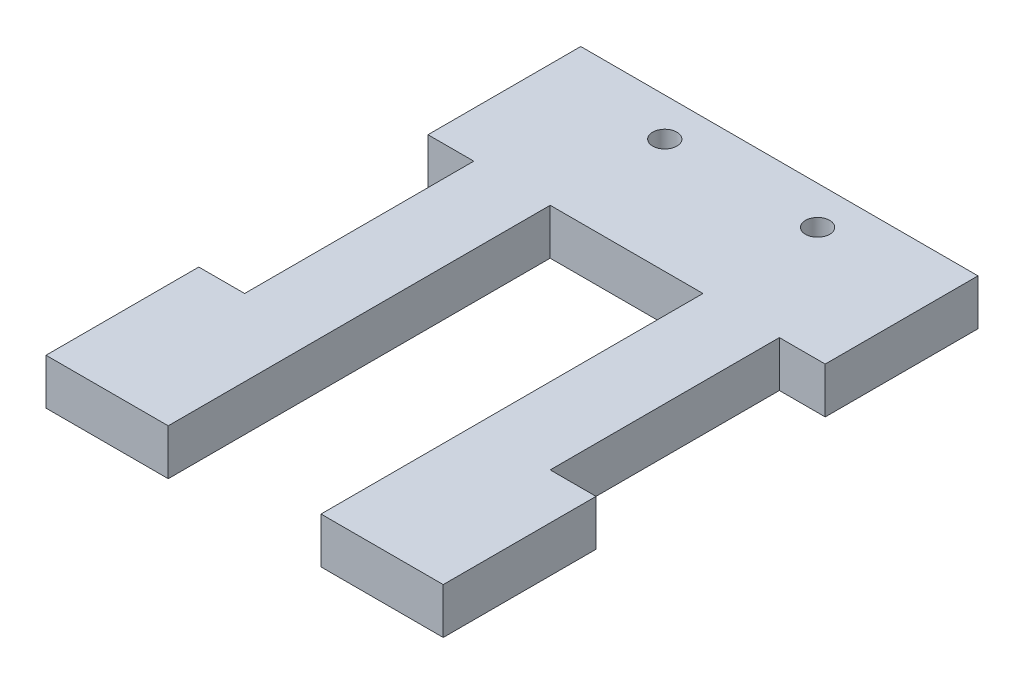
ISO-10303-21;
HEADER;
FILE_DESCRIPTION(('STEP AP214'),'2;1');
FILE_NAME('part.step','',(''),(''),'','','');
FILE_SCHEMA(('AUTOMOTIVE_DESIGN { 1 0 10303 214 1 1 1 1 }'));
ENDSEC;
DATA;
#1=APPLICATION_CONTEXT('core data for automotive mechanical design processes');
#2=APPLICATION_PROTOCOL_DEFINITION('international standard','automotive_design',2000,#1);
#3=PRODUCT_CONTEXT('',#1,'mechanical');
#4=PRODUCT('Part','Part','',(#3));
#5=PRODUCT_RELATED_PRODUCT_CATEGORY('part','',(#4));
#6=PRODUCT_DEFINITION_FORMATION('','',#4);
#7=PRODUCT_DEFINITION_CONTEXT('part definition',#1,'design');
#8=PRODUCT_DEFINITION('design','',#6,#7);
#9=PRODUCT_DEFINITION_SHAPE('','',#8);
#10=(LENGTH_UNIT() NAMED_UNIT(*) SI_UNIT(.MILLI.,.METRE.));
#11=(NAMED_UNIT(*) PLANE_ANGLE_UNIT() SI_UNIT($,.RADIAN.));
#12=(NAMED_UNIT(*) SI_UNIT($,.STERADIAN.) SOLID_ANGLE_UNIT());
#13=UNCERTAINTY_MEASURE_WITH_UNIT(LENGTH_MEASURE(1.E-05),#10,'distance_accuracy_value','');
#14=(GEOMETRIC_REPRESENTATION_CONTEXT(3) GLOBAL_UNCERTAINTY_ASSIGNED_CONTEXT((#13)) GLOBAL_UNIT_ASSIGNED_CONTEXT((#10,
#11,#12)) REPRESENTATION_CONTEXT('',''));
#15=CARTESIAN_POINT('',(0.,0.,0.));
#16=DIRECTION('',(0.,0.,1.));
#17=DIRECTION('',(1.,0.,0.));
#18=AXIS2_PLACEMENT_3D('',#15,#16,#17);
#19=CARTESIAN_POINT('',(-9.99999999999999,6.,0.));
#20=DIRECTION('',(-1.,0.,0.));
#21=DIRECTION('',(0.,0.,1.));
#22=AXIS2_PLACEMENT_3D('',#19,#20,#21);
#23=PLANE('',#22);
#24=DIRECTION('',(0.,0.,-1.));
#25=VECTOR('',#24,1.);
#26=CARTESIAN_POINT('',(-9.99999999999999,0.,0.));
#27=LINE('',#26,#25);
#28=CARTESIAN_POINT('',(-9.99999999999999,0.,35.));
#29=VERTEX_POINT('',#28);
#30=CARTESIAN_POINT('',(-9.99999999999999,0.,-15.));
#31=VERTEX_POINT('',#30);
#32=EDGE_CURVE('E180',#29,#31,#27,.T.);
#33=ORIENTED_EDGE('',*,*,#32,.T.);
#34=DIRECTION('',(0.,-1.,0.));
#35=VECTOR('',#34,1.);
#36=CARTESIAN_POINT('',(-9.99999999999999,6.,-15.));
#37=LINE('',#36,#35);
#38=CARTESIAN_POINT('',(-9.99999999999999,6.,-15.));
#39=VERTEX_POINT('',#38);
#40=EDGE_CURVE('E11',#39,#31,#37,.T.);
#41=ORIENTED_EDGE('',*,*,#40,.F.);
#42=DIRECTION('',(0.,0.,-1.));
#43=VECTOR('',#42,1.);
#44=CARTESIAN_POINT('',(-9.99999999999999,6.,0.));
#45=LINE('',#44,#43);
#46=CARTESIAN_POINT('',(-9.99999999999999,6.,35.));
#47=VERTEX_POINT('',#46);
#48=EDGE_CURVE('E221',#47,#39,#45,.T.);
#49=ORIENTED_EDGE('',*,*,#48,.F.);
#50=DIRECTION('',(0.,-1.,0.));
#51=VECTOR('',#50,1.);
#52=CARTESIAN_POINT('',(-9.99999999999999,6.,35.));
#53=LINE('',#52,#51);
#54=EDGE_CURVE('E176',#47,#29,#53,.T.);
#55=ORIENTED_EDGE('',*,*,#54,.T.);
#56=EDGE_LOOP('',(#33,#41,#49,#55));
#57=FACE_BOUND('',#56,.T.);
#58=ADVANCED_FACE('F35',(#57),#23,.F.);
#59=CARTESIAN_POINT('',(0.,6.,-15.));
#60=DIRECTION('',(0.,0.,-1.));
#61=DIRECTION('',(-1.,0.,0.));
#62=AXIS2_PLACEMENT_3D('',#59,#60,#61);
#63=PLANE('',#62);
#64=DIRECTION('',(1.,0.,0.));
#65=VECTOR('',#64,1.);
#66=CARTESIAN_POINT('',(0.,0.,-15.));
#67=LINE('',#66,#65);
#68=CARTESIAN_POINT('',(10.,0.,-15.));
#69=VERTEX_POINT('',#68);
#70=EDGE_CURVE('E183',#31,#69,#67,.T.);
#71=ORIENTED_EDGE('',*,*,#70,.T.);
#72=DIRECTION('',(0.,-1.,0.));
#73=VECTOR('',#72,1.);
#74=CARTESIAN_POINT('',(10.,6.,-15.));
#75=LINE('',#74,#73);
#76=CARTESIAN_POINT('',(10.,6.,-15.));
#77=VERTEX_POINT('',#76);
#78=EDGE_CURVE('E43',#77,#69,#75,.T.);
#79=ORIENTED_EDGE('',*,*,#78,.F.);
#80=DIRECTION('',(1.,0.,0.));
#81=VECTOR('',#80,1.);
#82=CARTESIAN_POINT('',(0.,6.,-15.));
#83=LINE('',#82,#81);
#84=EDGE_CURVE('E118',#39,#77,#83,.T.);
#85=ORIENTED_EDGE('',*,*,#84,.F.);
#86=ORIENTED_EDGE('',*,*,#40,.T.);
#87=EDGE_LOOP('',(#71,#79,#85,#86));
#88=FACE_BOUND('',#87,.T.);
#89=ADVANCED_FACE('F251',(#88),#63,.F.);
#90=CARTESIAN_POINT('',(10.,6.,0.));
#91=DIRECTION('',(-1.,0.,0.));
#92=DIRECTION('',(0.,0.,1.));
#93=AXIS2_PLACEMENT_3D('',#90,#91,#92);
#94=PLANE('',#93);
#95=DIRECTION('',(0.,0.,-1.));
#96=VECTOR('',#95,1.);
#97=CARTESIAN_POINT('',(10.,0.,0.));
#98=LINE('',#97,#96);
#99=CARTESIAN_POINT('',(10.,0.,35.));
#100=VERTEX_POINT('',#99);
#101=EDGE_CURVE('E187',#100,#69,#98,.T.);
#102=ORIENTED_EDGE('',*,*,#101,.F.);
#103=DIRECTION('',(0.,-1.,0.));
#104=VECTOR('',#103,1.);
#105=CARTESIAN_POINT('',(10.,6.,35.));
#106=LINE('',#105,#104);
#107=CARTESIAN_POINT('',(10.,6.,35.));
#108=VERTEX_POINT('',#107);
#109=EDGE_CURVE('E244',#108,#100,#106,.T.);
#110=ORIENTED_EDGE('',*,*,#109,.F.);
#111=DIRECTION('',(0.,0.,-1.));
#112=VECTOR('',#111,1.);
#113=CARTESIAN_POINT('',(10.,6.,0.));
#114=LINE('',#113,#112);
#115=EDGE_CURVE('E250',#108,#77,#114,.T.);
#116=ORIENTED_EDGE('',*,*,#115,.T.);
#117=ORIENTED_EDGE('',*,*,#78,.T.);
#118=EDGE_LOOP('',(#102,#110,#116,#117));
#119=FACE_BOUND('',#118,.T.);
#120=ADVANCED_FACE('F248',(#119),#94,.T.);
#121=CARTESIAN_POINT('',(0.,6.,35.));
#122=DIRECTION('',(0.,0.,-1.));
#123=DIRECTION('',(-1.,0.,0.));
#124=AXIS2_PLACEMENT_3D('',#121,#122,#123);
#125=PLANE('',#124);
#126=DIRECTION('',(1.,0.,0.));
#127=VECTOR('',#126,1.);
#128=CARTESIAN_POINT('',(0.,0.,35.));
#129=LINE('',#128,#127);
#130=CARTESIAN_POINT('',(26.,0.,35.));
#131=VERTEX_POINT('',#130);
#132=EDGE_CURVE('E190',#100,#131,#129,.T.);
#133=ORIENTED_EDGE('',*,*,#132,.T.);
#134=DIRECTION('',(0.,-1.,0.));
#135=VECTOR('',#134,1.);
#136=CARTESIAN_POINT('',(26.,6.,35.));
#137=LINE('',#136,#135);
#138=CARTESIAN_POINT('',(26.,6.,35.));
#139=VERTEX_POINT('',#138);
#140=EDGE_CURVE('E242',#139,#131,#137,.T.);
#141=ORIENTED_EDGE('',*,*,#140,.F.);
#142=DIRECTION('',(1.,0.,0.));
#143=VECTOR('',#142,1.);
#144=CARTESIAN_POINT('',(0.,6.,35.));
#145=LINE('',#144,#143);
#146=EDGE_CURVE('E263',#108,#139,#145,.T.);
#147=ORIENTED_EDGE('',*,*,#146,.F.);
#148=ORIENTED_EDGE('',*,*,#109,.T.);
#149=EDGE_LOOP('',(#133,#141,#147,#148));
#150=FACE_BOUND('',#149,.T.);
#151=ADVANCED_FACE('F260',(#150),#125,.F.);
#152=CARTESIAN_POINT('',(26.,6.,0.));
#153=DIRECTION('',(1.,0.,0.));
#154=DIRECTION('',(0.,0.,-1.));
#155=AXIS2_PLACEMENT_3D('',#152,#153,#154);
#156=PLANE('',#155);
#157=DIRECTION('',(0.,0.,1.));
#158=VECTOR('',#157,1.);
#159=CARTESIAN_POINT('',(26.,0.,0.));
#160=LINE('',#159,#158);
#161=CARTESIAN_POINT('',(26.,0.,15.));
#162=VERTEX_POINT('',#161);
#163=EDGE_CURVE('E193',#162,#131,#160,.T.);
#164=ORIENTED_EDGE('',*,*,#163,.F.);
#165=DIRECTION('',(0.,-1.,0.));
#166=VECTOR('',#165,1.);
#167=CARTESIAN_POINT('',(26.,6.,15.));
#168=LINE('',#167,#166);
#169=CARTESIAN_POINT('',(26.,6.,15.));
#170=VERTEX_POINT('',#169);
#171=EDGE_CURVE('E240',#170,#162,#168,.T.);
#172=ORIENTED_EDGE('',*,*,#171,.F.);
#173=DIRECTION('',(0.,0.,1.));
#174=VECTOR('',#173,1.);
#175=CARTESIAN_POINT('',(26.,6.,0.));
#176=LINE('',#175,#174);
#177=EDGE_CURVE('E265',#170,#139,#176,.T.);
#178=ORIENTED_EDGE('',*,*,#177,.T.);
#179=ORIENTED_EDGE('',*,*,#140,.T.);
#180=EDGE_LOOP('',(#164,#172,#178,#179));
#181=FACE_BOUND('',#180,.T.);
#182=ADVANCED_FACE('F462',(#181),#156,.T.);
#183=CARTESIAN_POINT('',(0.,6.,15.));
#184=DIRECTION('',(0.,0.,-1.));
#185=DIRECTION('',(-1.,0.,0.));
#186=AXIS2_PLACEMENT_3D('',#183,#184,#185);
#187=PLANE('',#186);
#188=DIRECTION('',(1.,0.,0.));
#189=VECTOR('',#188,1.);
#190=CARTESIAN_POINT('',(0.,0.,15.));
#191=LINE('',#190,#189);
#192=CARTESIAN_POINT('',(20.,0.,15.));
#193=VERTEX_POINT('',#192);
#194=EDGE_CURVE('E196',#193,#162,#191,.T.);
#195=ORIENTED_EDGE('',*,*,#194,.F.);
#196=DIRECTION('',(0.,-1.,0.));
#197=VECTOR('',#196,1.);
#198=CARTESIAN_POINT('',(20.,6.,15.));
#199=LINE('',#198,#197);
#200=CARTESIAN_POINT('',(20.,6.,15.));
#201=VERTEX_POINT('',#200);
#202=EDGE_CURVE('E238',#201,#193,#199,.T.);
#203=ORIENTED_EDGE('',*,*,#202,.F.);
#204=DIRECTION('',(1.,0.,0.));
#205=VECTOR('',#204,1.);
#206=CARTESIAN_POINT('',(0.,6.,15.));
#207=LINE('',#206,#205);
#208=EDGE_CURVE('E272',#201,#170,#207,.T.);
#209=ORIENTED_EDGE('',*,*,#208,.T.);
#210=ORIENTED_EDGE('',*,*,#171,.T.);
#211=EDGE_LOOP('',(#195,#203,#209,#210));
#212=FACE_BOUND('',#211,.T.);
#213=ADVANCED_FACE('F451',(#212),#187,.T.);
#214=CARTESIAN_POINT('',(20.,6.,0.));
#215=DIRECTION('',(1.,0.,0.));
#216=DIRECTION('',(0.,0.,-1.));
#217=AXIS2_PLACEMENT_3D('',#214,#215,#216);
#218=PLANE('',#217);
#219=DIRECTION('',(0.,0.,1.));
#220=VECTOR('',#219,1.);
#221=CARTESIAN_POINT('',(20.,0.,0.));
#222=LINE('',#221,#220);
#223=CARTESIAN_POINT('',(20.,0.,-15.));
#224=VERTEX_POINT('',#223);
#225=EDGE_CURVE('E199',#224,#193,#222,.T.);
#226=ORIENTED_EDGE('',*,*,#225,.F.);
#227=DIRECTION('',(0.,-1.,0.));
#228=VECTOR('',#227,1.);
#229=CARTESIAN_POINT('',(20.,6.,-15.));
#230=LINE('',#229,#228);
#231=CARTESIAN_POINT('',(20.,6.,-15.));
#232=VERTEX_POINT('',#231);
#233=EDGE_CURVE('E236',#232,#224,#230,.T.);
#234=ORIENTED_EDGE('',*,*,#233,.F.);
#235=DIRECTION('',(0.,0.,1.));
#236=VECTOR('',#235,1.);
#237=CARTESIAN_POINT('',(20.,6.,0.));
#238=LINE('',#237,#236);
#239=EDGE_CURVE('E275',#232,#201,#238,.T.);
#240=ORIENTED_EDGE('',*,*,#239,.T.);
#241=ORIENTED_EDGE('',*,*,#202,.T.);
#242=EDGE_LOOP('',(#226,#234,#240,#241));
#243=FACE_BOUND('',#242,.T.);
#244=ADVANCED_FACE('F441',(#243),#218,.T.);
#245=CARTESIAN_POINT('',(0.,6.,-15.));
#246=DIRECTION('',(0.,0.,-1.));
#247=DIRECTION('',(-1.,0.,0.));
#248=AXIS2_PLACEMENT_3D('',#245,#246,#247);
#249=PLANE('',#248);
#250=DIRECTION('',(1.,0.,0.));
#251=VECTOR('',#250,1.);
#252=CARTESIAN_POINT('',(0.,0.,-15.));
#253=LINE('',#252,#251);
#254=CARTESIAN_POINT('',(26.,0.,-15.));
#255=VERTEX_POINT('',#254);
#256=EDGE_CURVE('E202',#224,#255,#253,.T.);
#257=ORIENTED_EDGE('',*,*,#256,.T.);
#258=DIRECTION('',(0.,-1.,0.));
#259=VECTOR('',#258,1.);
#260=CARTESIAN_POINT('',(26.,6.,-15.));
#261=LINE('',#260,#259);
#262=CARTESIAN_POINT('',(26.,6.,-15.));
#263=VERTEX_POINT('',#262);
#264=EDGE_CURVE('E233',#263,#255,#261,.T.);
#265=ORIENTED_EDGE('',*,*,#264,.F.);
#266=DIRECTION('',(1.,0.,0.));
#267=VECTOR('',#266,1.);
#268=CARTESIAN_POINT('',(0.,6.,-15.));
#269=LINE('',#268,#267);
#270=EDGE_CURVE('E278',#232,#263,#269,.T.);
#271=ORIENTED_EDGE('',*,*,#270,.F.);
#272=ORIENTED_EDGE('',*,*,#233,.T.);
#273=EDGE_LOOP('',(#257,#265,#271,#272));
#274=FACE_BOUND('',#273,.T.);
#275=ADVANCED_FACE('F430',(#274),#249,.F.);
#276=CARTESIAN_POINT('',(26.,6.,0.));
#277=DIRECTION('',(-1.,0.,0.));
#278=DIRECTION('',(0.,0.,1.));
#279=AXIS2_PLACEMENT_3D('',#276,#277,#278);
#280=PLANE('',#279);
#281=DIRECTION('',(0.,0.,-1.));
#282=VECTOR('',#281,1.);
#283=CARTESIAN_POINT('',(26.,0.,0.));
#284=LINE('',#283,#282);
#285=CARTESIAN_POINT('',(26.,0.,-35.));
#286=VERTEX_POINT('',#285);
#287=EDGE_CURVE('E204',#255,#286,#284,.T.);
#288=ORIENTED_EDGE('',*,*,#287,.T.);
#289=DIRECTION('',(0.,-1.,0.));
#290=VECTOR('',#289,1.);
#291=CARTESIAN_POINT('',(26.,6.,-35.));
#292=LINE('',#291,#290);
#293=CARTESIAN_POINT('',(26.,6.,-35.));
#294=VERTEX_POINT('',#293);
#295=EDGE_CURVE('E231',#294,#286,#292,.T.);
#296=ORIENTED_EDGE('',*,*,#295,.F.);
#297=DIRECTION('',(0.,0.,-1.));
#298=VECTOR('',#297,1.);
#299=CARTESIAN_POINT('',(26.,6.,0.));
#300=LINE('',#299,#298);
#301=EDGE_CURVE('E280',#263,#294,#300,.T.);
#302=ORIENTED_EDGE('',*,*,#301,.F.);
#303=ORIENTED_EDGE('',*,*,#264,.T.);
#304=EDGE_LOOP('',(#288,#296,#302,#303));
#305=FACE_BOUND('',#304,.T.);
#306=ADVANCED_FACE('F419',(#305),#280,.F.);
#307=CARTESIAN_POINT('',(0.,6.,-35.));
#308=DIRECTION('',(0.,0.,-1.));
#309=DIRECTION('',(-1.,0.,0.));
#310=AXIS2_PLACEMENT_3D('',#307,#308,#309);
#311=PLANE('',#310);
#312=DIRECTION('',(1.,0.,0.));
#313=VECTOR('',#312,1.);
#314=CARTESIAN_POINT('',(0.,0.,-35.));
#315=LINE('',#314,#313);
#316=CARTESIAN_POINT('',(-26.,0.,-35.));
#317=VERTEX_POINT('',#316);
#318=EDGE_CURVE('E207',#317,#286,#315,.T.);
#319=ORIENTED_EDGE('',*,*,#318,.F.);
#320=DIRECTION('',(0.,-1.,0.));
#321=VECTOR('',#320,1.);
#322=CARTESIAN_POINT('',(-26.,6.,-35.));
#323=LINE('',#322,#321);
#324=CARTESIAN_POINT('',(-26.,6.,-35.));
#325=VERTEX_POINT('',#324);
#326=EDGE_CURVE('E229',#325,#317,#323,.T.);
#327=ORIENTED_EDGE('',*,*,#326,.F.);
#328=DIRECTION('',(1.,0.,0.));
#329=VECTOR('',#328,1.);
#330=CARTESIAN_POINT('',(0.,6.,-35.));
#331=LINE('',#330,#329);
#332=EDGE_CURVE('E282',#325,#294,#331,.T.);
#333=ORIENTED_EDGE('',*,*,#332,.T.);
#334=ORIENTED_EDGE('',*,*,#295,.T.);
#335=EDGE_LOOP('',(#319,#327,#333,#334));
#336=FACE_BOUND('',#335,.T.);
#337=ADVANCED_FACE('F410',(#336),#311,.T.);
#338=CARTESIAN_POINT('',(-26.,6.,0.));
#339=DIRECTION('',(-1.,0.,0.));
#340=DIRECTION('',(0.,0.,1.));
#341=AXIS2_PLACEMENT_3D('',#338,#339,#340);
#342=PLANE('',#341);
#343=DIRECTION('',(0.,0.,-1.));
#344=VECTOR('',#343,1.);
#345=CARTESIAN_POINT('',(-26.,0.,0.));
#346=LINE('',#345,#344);
#347=CARTESIAN_POINT('',(-26.,0.,-15.));
#348=VERTEX_POINT('',#347);
#349=EDGE_CURVE('E210',#348,#317,#346,.T.);
#350=ORIENTED_EDGE('',*,*,#349,.F.);
#351=DIRECTION('',(0.,-1.,0.));
#352=VECTOR('',#351,1.);
#353=CARTESIAN_POINT('',(-26.,6.,-15.));
#354=LINE('',#353,#352);
#355=CARTESIAN_POINT('',(-26.,6.,-15.));
#356=VERTEX_POINT('',#355);
#357=EDGE_CURVE('E227',#356,#348,#354,.T.);
#358=ORIENTED_EDGE('',*,*,#357,.F.);
#359=DIRECTION('',(0.,0.,-1.));
#360=VECTOR('',#359,1.);
#361=CARTESIAN_POINT('',(-26.,6.,0.));
#362=LINE('',#361,#360);
#363=EDGE_CURVE('E285',#356,#325,#362,.T.);
#364=ORIENTED_EDGE('',*,*,#363,.T.);
#365=ORIENTED_EDGE('',*,*,#326,.T.);
#366=EDGE_LOOP('',(#350,#358,#364,#365));
#367=FACE_BOUND('',#366,.T.);
#368=ADVANCED_FACE('F297',(#367),#342,.T.);
#369=CARTESIAN_POINT('',(0.,6.,-15.));
#370=DIRECTION('',(0.,0.,1.));
#371=DIRECTION('',(1.,0.,0.));
#372=AXIS2_PLACEMENT_3D('',#369,#370,#371);
#373=PLANE('',#372);
#374=DIRECTION('',(-1.,0.,0.));
#375=VECTOR('',#374,1.);
#376=CARTESIAN_POINT('',(0.,0.,-15.));
#377=LINE('',#376,#375);
#378=CARTESIAN_POINT('',(-20.,0.,-15.));
#379=VERTEX_POINT('',#378);
#380=EDGE_CURVE('E213',#379,#348,#377,.T.);
#381=ORIENTED_EDGE('',*,*,#380,.F.);
#382=DIRECTION('',(0.,-1.,0.));
#383=VECTOR('',#382,1.);
#384=CARTESIAN_POINT('',(-20.,6.,-15.));
#385=LINE('',#384,#383);
#386=CARTESIAN_POINT('',(-20.,6.,-15.));
#387=VERTEX_POINT('',#386);
#388=EDGE_CURVE('E225',#387,#379,#385,.T.);
#389=ORIENTED_EDGE('',*,*,#388,.F.);
#390=DIRECTION('',(-1.,0.,0.));
#391=VECTOR('',#390,1.);
#392=CARTESIAN_POINT('',(0.,6.,-15.));
#393=LINE('',#392,#391);
#394=EDGE_CURVE('E288',#387,#356,#393,.T.);
#395=ORIENTED_EDGE('',*,*,#394,.T.);
#396=ORIENTED_EDGE('',*,*,#357,.T.);
#397=EDGE_LOOP('',(#381,#389,#395,#396));
#398=FACE_BOUND('',#397,.T.);
#399=ADVANCED_FACE('F292',(#398),#373,.T.);
#400=CARTESIAN_POINT('',(-20.,6.,0.));
#401=DIRECTION('',(1.,0.,0.));
#402=DIRECTION('',(0.,0.,-1.));
#403=AXIS2_PLACEMENT_3D('',#400,#401,#402);
#404=PLANE('',#403);
#405=DIRECTION('',(0.,0.,1.));
#406=VECTOR('',#405,1.);
#407=CARTESIAN_POINT('',(-20.,0.,0.));
#408=LINE('',#407,#406);
#409=CARTESIAN_POINT('',(-20.,0.,15.));
#410=VERTEX_POINT('',#409);
#411=EDGE_CURVE('E216',#379,#410,#408,.T.);
#412=ORIENTED_EDGE('',*,*,#411,.T.);
#413=DIRECTION('',(0.,-1.,0.));
#414=VECTOR('',#413,1.);
#415=CARTESIAN_POINT('',(-20.,6.,15.));
#416=LINE('',#415,#414);
#417=CARTESIAN_POINT('',(-20.,6.,15.));
#418=VERTEX_POINT('',#417);
#419=EDGE_CURVE('E171',#418,#410,#416,.T.);
#420=ORIENTED_EDGE('',*,*,#419,.F.);
#421=DIRECTION('',(0.,0.,1.));
#422=VECTOR('',#421,1.);
#423=CARTESIAN_POINT('',(-20.,6.,0.));
#424=LINE('',#423,#422);
#425=EDGE_CURVE('E162',#387,#418,#424,.T.);
#426=ORIENTED_EDGE('',*,*,#425,.F.);
#427=ORIENTED_EDGE('',*,*,#388,.T.);
#428=EDGE_LOOP('',(#412,#420,#426,#427));
#429=FACE_BOUND('',#428,.T.);
#430=ADVANCED_FACE('F301',(#429),#404,.F.);
#431=CARTESIAN_POINT('',(0.,6.,15.));
#432=DIRECTION('',(0.,0.,1.));
#433=DIRECTION('',(1.,0.,0.));
#434=AXIS2_PLACEMENT_3D('',#431,#432,#433);
#435=PLANE('',#434);
#436=DIRECTION('',(-1.,0.,0.));
#437=VECTOR('',#436,1.);
#438=CARTESIAN_POINT('',(0.,0.,15.));
#439=LINE('',#438,#437);
#440=CARTESIAN_POINT('',(-26.,0.,15.));
#441=VERTEX_POINT('',#440);
#442=EDGE_CURVE('E170',#410,#441,#439,.T.);
#443=ORIENTED_EDGE('',*,*,#442,.T.);
#444=DIRECTION('',(0.,-1.,0.));
#445=VECTOR('',#444,1.);
#446=CARTESIAN_POINT('',(-26.,6.,15.));
#447=LINE('',#446,#445);
#448=CARTESIAN_POINT('',(-26.,6.,15.));
#449=VERTEX_POINT('',#448);
#450=EDGE_CURVE('E167',#449,#441,#447,.T.);
#451=ORIENTED_EDGE('',*,*,#450,.F.);
#452=DIRECTION('',(-1.,0.,0.));
#453=VECTOR('',#452,1.);
#454=CARTESIAN_POINT('',(0.,6.,15.));
#455=LINE('',#454,#453);
#456=EDGE_CURVE('E155',#418,#449,#455,.T.);
#457=ORIENTED_EDGE('',*,*,#456,.F.);
#458=ORIENTED_EDGE('',*,*,#419,.T.);
#459=EDGE_LOOP('',(#443,#451,#457,#458));
#460=FACE_BOUND('',#459,.T.);
#461=ADVANCED_FACE('F168',(#460),#435,.F.);
#462=CARTESIAN_POINT('',(-26.,6.,0.));
#463=DIRECTION('',(1.,0.,0.));
#464=DIRECTION('',(0.,0.,-1.));
#465=AXIS2_PLACEMENT_3D('',#462,#463,#464);
#466=PLANE('',#465);
#467=DIRECTION('',(0.,0.,1.));
#468=VECTOR('',#467,1.);
#469=CARTESIAN_POINT('',(-26.,0.,0.));
#470=LINE('',#469,#468);
#471=CARTESIAN_POINT('',(-26.,0.,35.));
#472=VERTEX_POINT('',#471);
#473=EDGE_CURVE('E104',#441,#472,#470,.T.);
#474=ORIENTED_EDGE('',*,*,#473,.T.);
#475=DIRECTION('',(0.,-1.,0.));
#476=VECTOR('',#475,1.);
#477=CARTESIAN_POINT('',(-26.,6.,35.));
#478=LINE('',#477,#476);
#479=CARTESIAN_POINT('',(-26.,6.,35.));
#480=VERTEX_POINT('',#479);
#481=EDGE_CURVE('E172',#480,#472,#478,.T.);
#482=ORIENTED_EDGE('',*,*,#481,.F.);
#483=DIRECTION('',(0.,0.,1.));
#484=VECTOR('',#483,1.);
#485=CARTESIAN_POINT('',(-26.,6.,0.));
#486=LINE('',#485,#484);
#487=EDGE_CURVE('E159',#449,#480,#486,.T.);
#488=ORIENTED_EDGE('',*,*,#487,.F.);
#489=ORIENTED_EDGE('',*,*,#450,.T.);
#490=EDGE_LOOP('',(#474,#482,#488,#489));
#491=FACE_BOUND('',#490,.T.);
#492=ADVANCED_FACE('F174',(#491),#466,.F.);
#493=CARTESIAN_POINT('',(0.,6.,35.));
#494=DIRECTION('',(0.,0.,-1.));
#495=DIRECTION('',(-1.,0.,0.));
#496=AXIS2_PLACEMENT_3D('',#493,#494,#495);
#497=PLANE('',#496);
#498=DIRECTION('',(1.,0.,0.));
#499=VECTOR('',#498,1.);
#500=CARTESIAN_POINT('',(0.,0.,35.));
#501=LINE('',#500,#499);
#502=EDGE_CURVE('E110',#472,#29,#501,.T.);
#503=ORIENTED_EDGE('',*,*,#502,.T.);
#504=ORIENTED_EDGE('',*,*,#54,.F.);
#505=DIRECTION('',(1.,0.,0.));
#506=VECTOR('',#505,1.);
#507=CARTESIAN_POINT('',(0.,6.,35.));
#508=LINE('',#507,#506);
#509=EDGE_CURVE('E51',#480,#47,#508,.T.);
#510=ORIENTED_EDGE('',*,*,#509,.F.);
#511=ORIENTED_EDGE('',*,*,#481,.T.);
#512=EDGE_LOOP('',(#503,#504,#510,#511));
#513=FACE_BOUND('',#512,.T.);
#514=ADVANCED_FACE('F316',(#513),#497,.F.);
#515=CARTESIAN_POINT('',(0.,6.,0.));
#516=DIRECTION('',(0.,1.,0.));
#517=DIRECTION('',(0.,0.,1.));
#518=AXIS2_PLACEMENT_3D('',#515,#516,#517);
#519=PLANE('',#518);
#520=CARTESIAN_POINT('',(9.99999999999998,6.,-30.));
#521=DIRECTION('',(0.,1.,0.));
#522=DIRECTION('',(0.,0.,-1.));
#523=AXIS2_PLACEMENT_3D('',#520,#521,#522);
#524=CIRCLE('',#523,1.5875);
#525=CARTESIAN_POINT('',(9.99999999999998,6.,-31.5875));
#526=VERTEX_POINT('',#525);
#527=EDGE_CURVE('E345',#526,#526,#524,.T.);
#528=ORIENTED_EDGE('',*,*,#527,.F.);
#529=EDGE_LOOP('',(#528));
#530=FACE_BOUND('',#529,.T.);
#531=CARTESIAN_POINT('',(-9.99999999999997,6.,-30.));
#532=DIRECTION('',(0.,1.,0.));
#533=DIRECTION('',(0.,0.,1.));
#534=AXIS2_PLACEMENT_3D('',#531,#532,#533);
#535=CIRCLE('',#534,1.5875);
#536=CARTESIAN_POINT('',(-9.99999999999997,6.,-28.4125));
#537=VERTEX_POINT('',#536);
#538=EDGE_CURVE('E347',#537,#537,#535,.T.);
#539=ORIENTED_EDGE('',*,*,#538,.F.);
#540=EDGE_LOOP('',(#539));
#541=FACE_BOUND('',#540,.T.);
#542=ORIENTED_EDGE('',*,*,#48,.T.);
#543=ORIENTED_EDGE('',*,*,#84,.T.);
#544=ORIENTED_EDGE('',*,*,#115,.F.);
#545=ORIENTED_EDGE('',*,*,#146,.T.);
#546=ORIENTED_EDGE('',*,*,#177,.F.);
#547=ORIENTED_EDGE('',*,*,#208,.F.);
#548=ORIENTED_EDGE('',*,*,#239,.F.);
#549=ORIENTED_EDGE('',*,*,#270,.T.);
#550=ORIENTED_EDGE('',*,*,#301,.T.);
#551=ORIENTED_EDGE('',*,*,#332,.F.);
#552=ORIENTED_EDGE('',*,*,#363,.F.);
#553=ORIENTED_EDGE('',*,*,#394,.F.);
#554=ORIENTED_EDGE('',*,*,#425,.T.);
#555=ORIENTED_EDGE('',*,*,#456,.T.);
#556=ORIENTED_EDGE('',*,*,#487,.T.);
#557=ORIENTED_EDGE('',*,*,#509,.T.);
#558=EDGE_LOOP('',(#542,#543,#544,#545,#546,#547,#548,#549,#550,#551,#552,#553,#554,#555,#556,#557));
#559=FACE_BOUND('',#558,.T.);
#560=ADVANCED_FACE('F157',(#530,#541,#559),#519,.T.);
#561=CARTESIAN_POINT('',(0.,0.,0.));
#562=DIRECTION('',(0.,1.,0.));
#563=DIRECTION('',(0.,0.,1.));
#564=AXIS2_PLACEMENT_3D('',#561,#562,#563);
#565=PLANE('',#564);
#566=CARTESIAN_POINT('',(9.99999999999998,0.,-30.));
#567=DIRECTION('',(0.,1.,0.));
#568=DIRECTION('',(0.,0.,-1.));
#569=AXIS2_PLACEMENT_3D('',#566,#567,#568);
#570=CIRCLE('',#569,1.5875);
#571=CARTESIAN_POINT('',(9.99999999999998,0.,-31.5875));
#572=VERTEX_POINT('',#571);
#573=EDGE_CURVE('E342',#572,#572,#570,.T.);
#574=ORIENTED_EDGE('',*,*,#573,.T.);
#575=EDGE_LOOP('',(#574));
#576=FACE_BOUND('',#575,.T.);
#577=CARTESIAN_POINT('',(-9.99999999999997,0.,-30.));
#578=DIRECTION('',(0.,1.,0.));
#579=DIRECTION('',(0.,0.,1.));
#580=AXIS2_PLACEMENT_3D('',#577,#578,#579);
#581=CIRCLE('',#580,1.5875);
#582=CARTESIAN_POINT('',(-9.99999999999997,0.,-28.4125));
#583=VERTEX_POINT('',#582);
#584=EDGE_CURVE('E184',#583,#583,#581,.T.);
#585=ORIENTED_EDGE('',*,*,#584,.T.);
#586=EDGE_LOOP('',(#585));
#587=FACE_BOUND('',#586,.T.);
#588=ORIENTED_EDGE('',*,*,#32,.F.);
#589=ORIENTED_EDGE('',*,*,#502,.F.);
#590=ORIENTED_EDGE('',*,*,#473,.F.);
#591=ORIENTED_EDGE('',*,*,#442,.F.);
#592=ORIENTED_EDGE('',*,*,#411,.F.);
#593=ORIENTED_EDGE('',*,*,#380,.T.);
#594=ORIENTED_EDGE('',*,*,#349,.T.);
#595=ORIENTED_EDGE('',*,*,#318,.T.);
#596=ORIENTED_EDGE('',*,*,#287,.F.);
#597=ORIENTED_EDGE('',*,*,#256,.F.);
#598=ORIENTED_EDGE('',*,*,#225,.T.);
#599=ORIENTED_EDGE('',*,*,#194,.T.);
#600=ORIENTED_EDGE('',*,*,#163,.T.);
#601=ORIENTED_EDGE('',*,*,#132,.F.);
#602=ORIENTED_EDGE('',*,*,#101,.T.);
#603=ORIENTED_EDGE('',*,*,#70,.F.);
#604=EDGE_LOOP('',(#588,#589,#590,#591,#592,#593,#594,#595,#596,#597,#598,#599,#600,#601,#602,#603));
#605=FACE_BOUND('',#604,.T.);
#606=ADVANCED_FACE('F256',(#576,#587,#605),#565,.F.);
#607=CARTESIAN_POINT('',(-9.99999999999997,0.,-30.));
#608=DIRECTION('',(0.,1.,0.));
#609=DIRECTION('',(0.,0.,1.));
#610=AXIS2_PLACEMENT_3D('',#607,#608,#609);
#611=CYLINDRICAL_SURFACE('',#610,1.5875);
#612=ORIENTED_EDGE('',*,*,#584,.F.);
#613=EDGE_LOOP('',(#612));
#614=FACE_BOUND('',#613,.T.);
#615=ORIENTED_EDGE('',*,*,#538,.T.);
#616=EDGE_LOOP('',(#615));
#617=FACE_BOUND('',#616,.T.);
#618=ADVANCED_FACE('F328',(#614,#617),#611,.F.);
#619=CARTESIAN_POINT('',(9.99999999999998,0.,-30.));
#620=DIRECTION('',(0.,1.,0.));
#621=DIRECTION('',(0.,0.,1.));
#622=AXIS2_PLACEMENT_3D('',#619,#620,#621);
#623=CYLINDRICAL_SURFACE('',#622,1.5875);
#624=ORIENTED_EDGE('',*,*,#573,.F.);
#625=EDGE_LOOP('',(#624));
#626=FACE_BOUND('',#625,.T.);
#627=ORIENTED_EDGE('',*,*,#527,.T.);
#628=EDGE_LOOP('',(#627));
#629=FACE_BOUND('',#628,.T.);
#630=ADVANCED_FACE('F333',(#626,#629),#623,.F.);
#631=CLOSED_SHELL('',(#58,#89,#120,#151,#182,#213,#244,#275,#306,#337,#368,#399,#430,#461,#492,
#514,#560,#606,#618,#630));
#632=MANIFOLD_SOLID_BREP('B2',#631);
#633=ADVANCED_BREP_SHAPE_REPRESENTATION('',(#18,#632),#14);
#634=SHAPE_DEFINITION_REPRESENTATION(#9,#633);
ENDSEC;
END-ISO-10303-21;
